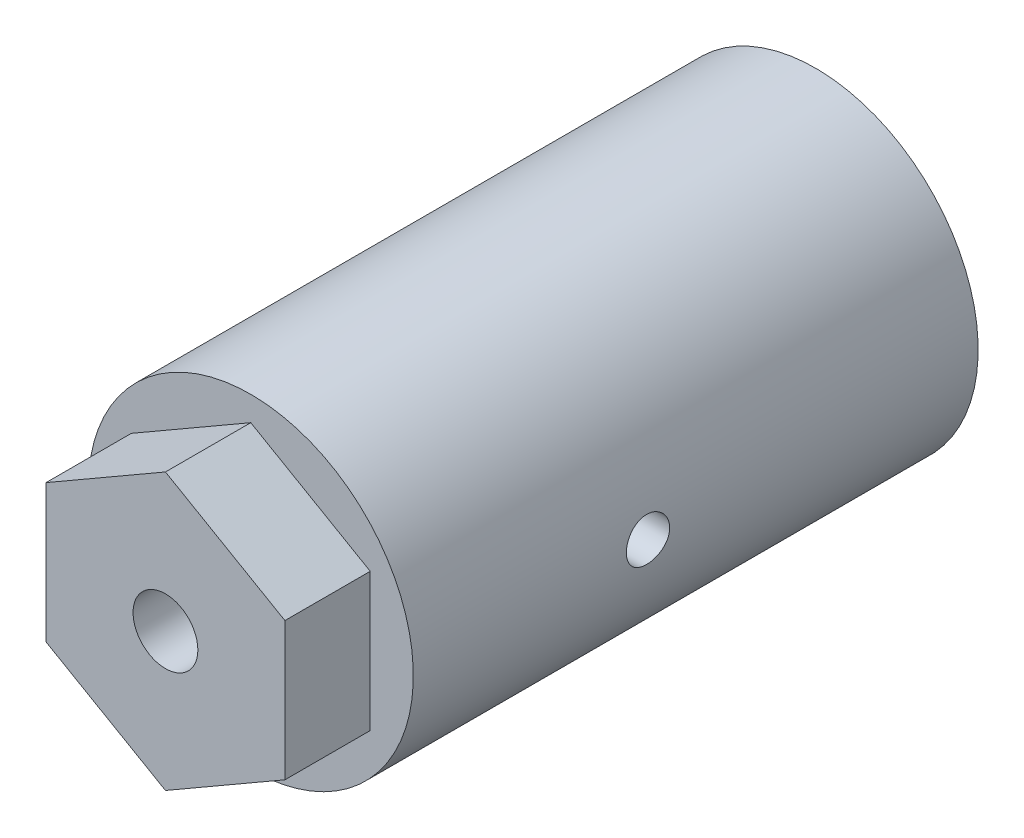
ISO-10303-21;
HEADER;
FILE_DESCRIPTION(('STEP AP214'),'2;1');
FILE_NAME('part.step','',(''),(''),'','','');
FILE_SCHEMA(('AUTOMOTIVE_DESIGN { 1 0 10303 214 1 1 1 1 }'));
ENDSEC;
DATA;
#1=APPLICATION_CONTEXT('core data for automotive mechanical design processes');
#2=APPLICATION_PROTOCOL_DEFINITION('international standard','automotive_design',2000,#1);
#3=PRODUCT_CONTEXT('',#1,'mechanical');
#4=PRODUCT('Part','Part','',(#3));
#5=PRODUCT_RELATED_PRODUCT_CATEGORY('part','',(#4));
#6=PRODUCT_DEFINITION_FORMATION('','',#4);
#7=PRODUCT_DEFINITION_CONTEXT('part definition',#1,'design');
#8=PRODUCT_DEFINITION('design','',#6,#7);
#9=PRODUCT_DEFINITION_SHAPE('','',#8);
#10=(LENGTH_UNIT() NAMED_UNIT(*) SI_UNIT(.MILLI.,.METRE.));
#11=(NAMED_UNIT(*) PLANE_ANGLE_UNIT() SI_UNIT($,.RADIAN.));
#12=(NAMED_UNIT(*) SI_UNIT($,.STERADIAN.) SOLID_ANGLE_UNIT());
#13=UNCERTAINTY_MEASURE_WITH_UNIT(LENGTH_MEASURE(1.E-05),#10,'distance_accuracy_value','');
#14=(GEOMETRIC_REPRESENTATION_CONTEXT(3) GLOBAL_UNCERTAINTY_ASSIGNED_CONTEXT((#13)) GLOBAL_UNIT_ASSIGNED_CONTEXT((#10,
#11,#12)) REPRESENTATION_CONTEXT('',''));
#15=CARTESIAN_POINT('',(0.,0.,0.));
#16=DIRECTION('',(0.,0.,1.));
#17=DIRECTION('',(1.,0.,0.));
#18=AXIS2_PLACEMENT_3D('',#15,#16,#17);
#19=CARTESIAN_POINT('',(7.,4.04145188432738,5.));
#20=DIRECTION('',(-0.5,-0.866025403784439,0.));
#21=DIRECTION('',(0.866025403784439,-0.5,0.));
#22=AXIS2_PLACEMENT_3D('',#19,#20,#21);
#23=PLANE('',#22);
#24=DIRECTION('',(-0.866025403784439,0.5,0.));
#25=VECTOR('',#24,1.);
#26=CARTESIAN_POINT('',(7.,4.04145188432738,0.));
#27=LINE('',#26,#25);
#28=CARTESIAN_POINT('',(7.,4.04145188432738,0.));
#29=VERTEX_POINT('',#28);
#30=CARTESIAN_POINT('',(0.,8.08290376865476,0.));
#31=VERTEX_POINT('',#30);
#32=EDGE_CURVE('E68',#29,#31,#27,.T.);
#33=ORIENTED_EDGE('',*,*,#32,.T.);
#34=DIRECTION('',(0.,0.,-1.));
#35=VECTOR('',#34,1.);
#36=CARTESIAN_POINT('',(0.,8.08290376865476,5.));
#37=LINE('',#36,#35);
#38=CARTESIAN_POINT('',(0.,8.08290376865476,5.));
#39=VERTEX_POINT('',#38);
#40=EDGE_CURVE('E139',#39,#31,#37,.T.);
#41=ORIENTED_EDGE('',*,*,#40,.F.);
#42=DIRECTION('',(-0.866025403784439,0.5,0.));
#43=VECTOR('',#42,1.);
#44=CARTESIAN_POINT('',(7.,4.04145188432738,5.));
#45=LINE('',#44,#43);
#46=CARTESIAN_POINT('',(7.,4.04145188432738,5.));
#47=VERTEX_POINT('',#46);
#48=EDGE_CURVE('E131',#47,#39,#45,.T.);
#49=ORIENTED_EDGE('',*,*,#48,.F.);
#50=DIRECTION('',(0.,0.,-1.));
#51=VECTOR('',#50,1.);
#52=CARTESIAN_POINT('',(7.,4.04145188432738,5.));
#53=LINE('',#52,#51);
#54=EDGE_CURVE('E116',#47,#29,#53,.T.);
#55=ORIENTED_EDGE('',*,*,#54,.T.);
#56=EDGE_LOOP('',(#33,#41,#49,#55));
#57=FACE_BOUND('',#56,.T.);
#58=ADVANCED_FACE('F33',(#57),#23,.F.);
#59=CARTESIAN_POINT('',(0.,8.08290376865476,5.));
#60=DIRECTION('',(0.5,-0.866025403784439,0.));
#61=DIRECTION('',(0.866025403784439,0.5,0.));
#62=AXIS2_PLACEMENT_3D('',#59,#60,#61);
#63=PLANE('',#62);
#64=DIRECTION('',(-0.866025403784439,-0.5,0.));
#65=VECTOR('',#64,1.);
#66=CARTESIAN_POINT('',(0.,8.08290376865476,0.));
#67=LINE('',#66,#65);
#68=CARTESIAN_POINT('',(-7.,4.04145188432738,0.));
#69=VERTEX_POINT('',#68);
#70=EDGE_CURVE('E77',#31,#69,#67,.T.);
#71=ORIENTED_EDGE('',*,*,#70,.T.);
#72=DIRECTION('',(0.,0.,-1.));
#73=VECTOR('',#72,1.);
#74=CARTESIAN_POINT('',(-7.,4.04145188432738,5.));
#75=LINE('',#74,#73);
#76=CARTESIAN_POINT('',(-7.,4.04145188432738,5.));
#77=VERTEX_POINT('',#76);
#78=EDGE_CURVE('E136',#77,#69,#75,.T.);
#79=ORIENTED_EDGE('',*,*,#78,.F.);
#80=DIRECTION('',(-0.866025403784439,-0.5,0.));
#81=VECTOR('',#80,1.);
#82=CARTESIAN_POINT('',(0.,8.08290376865476,5.));
#83=LINE('',#82,#81);
#84=EDGE_CURVE('E178',#39,#77,#83,.T.);
#85=ORIENTED_EDGE('',*,*,#84,.F.);
#86=ORIENTED_EDGE('',*,*,#40,.T.);
#87=EDGE_LOOP('',(#71,#79,#85,#86));
#88=FACE_BOUND('',#87,.T.);
#89=ADVANCED_FACE('F177',(#88),#63,.F.);
#90=CARTESIAN_POINT('',(-7.,4.04145188432738,5.));
#91=DIRECTION('',(1.,0.,0.));
#92=DIRECTION('',(0.,1.,0.));
#93=AXIS2_PLACEMENT_3D('',#90,#91,#92);
#94=PLANE('',#93);
#95=DIRECTION('',(0.,-1.,0.));
#96=VECTOR('',#95,1.);
#97=CARTESIAN_POINT('',(-7.,4.04145188432738,0.));
#98=LINE('',#97,#96);
#99=CARTESIAN_POINT('',(-7.00000000000001,-4.04145188432738,0.));
#100=VERTEX_POINT('',#99);
#101=EDGE_CURVE('E123',#69,#100,#98,.T.);
#102=ORIENTED_EDGE('',*,*,#101,.T.);
#103=DIRECTION('',(0.,0.,-1.));
#104=VECTOR('',#103,1.);
#105=CARTESIAN_POINT('',(-7.00000000000001,-4.04145188432738,5.));
#106=LINE('',#105,#104);
#107=CARTESIAN_POINT('',(-7.00000000000001,-4.04145188432738,5.));
#108=VERTEX_POINT('',#107);
#109=EDGE_CURVE('E110',#108,#100,#106,.T.);
#110=ORIENTED_EDGE('',*,*,#109,.F.);
#111=DIRECTION('',(0.,-1.,0.));
#112=VECTOR('',#111,1.);
#113=CARTESIAN_POINT('',(-7.,4.04145188432738,5.));
#114=LINE('',#113,#112);
#115=EDGE_CURVE('E96',#77,#108,#114,.T.);
#116=ORIENTED_EDGE('',*,*,#115,.F.);
#117=ORIENTED_EDGE('',*,*,#78,.T.);
#118=EDGE_LOOP('',(#102,#110,#116,#117));
#119=FACE_BOUND('',#118,.T.);
#120=ADVANCED_FACE('F174',(#119),#94,.F.);
#121=CARTESIAN_POINT('',(-7.00000000000001,-4.04145188432738,5.));
#122=DIRECTION('',(0.5,0.866025403784438,0.));
#123=DIRECTION('',(-0.866025403784438,0.5,0.));
#124=AXIS2_PLACEMENT_3D('',#121,#122,#123);
#125=PLANE('',#124);
#126=DIRECTION('',(0.866025403784438,-0.5,0.));
#127=VECTOR('',#126,1.);
#128=CARTESIAN_POINT('',(-7.00000000000001,-4.04145188432738,0.));
#129=LINE('',#128,#127);
#130=CARTESIAN_POINT('',(0.,-8.08290376865477,0.));
#131=VERTEX_POINT('',#130);
#132=EDGE_CURVE('E107',#100,#131,#129,.T.);
#133=ORIENTED_EDGE('',*,*,#132,.T.);
#134=DIRECTION('',(0.,0.,-1.));
#135=VECTOR('',#134,1.);
#136=CARTESIAN_POINT('',(0.,-8.08290376865477,5.));
#137=LINE('',#136,#135);
#138=CARTESIAN_POINT('',(0.,-8.08290376865477,5.));
#139=VERTEX_POINT('',#138);
#140=EDGE_CURVE('E103',#139,#131,#137,.T.);
#141=ORIENTED_EDGE('',*,*,#140,.F.);
#142=DIRECTION('',(0.866025403784438,-0.5,0.));
#143=VECTOR('',#142,1.);
#144=CARTESIAN_POINT('',(-7.00000000000001,-4.04145188432738,5.));
#145=LINE('',#144,#143);
#146=EDGE_CURVE('E89',#108,#139,#145,.T.);
#147=ORIENTED_EDGE('',*,*,#146,.F.);
#148=ORIENTED_EDGE('',*,*,#109,.T.);
#149=EDGE_LOOP('',(#133,#141,#147,#148));
#150=FACE_BOUND('',#149,.T.);
#151=ADVANCED_FACE('F104',(#150),#125,.F.);
#152=CARTESIAN_POINT('',(0.,-8.08290376865477,5.));
#153=DIRECTION('',(-0.5,0.866025403784438,0.));
#154=DIRECTION('',(-0.866025403784439,-0.5,0.));
#155=AXIS2_PLACEMENT_3D('',#152,#153,#154);
#156=PLANE('',#155);
#157=DIRECTION('',(0.866025403784439,0.5,0.));
#158=VECTOR('',#157,1.);
#159=CARTESIAN_POINT('',(0.,-8.08290376865477,0.));
#160=LINE('',#159,#158);
#161=CARTESIAN_POINT('',(7.,-4.04145188432738,0.));
#162=VERTEX_POINT('',#161);
#163=EDGE_CURVE('E127',#131,#162,#160,.T.);
#164=ORIENTED_EDGE('',*,*,#163,.T.);
#165=DIRECTION('',(0.,0.,-1.));
#166=VECTOR('',#165,1.);
#167=CARTESIAN_POINT('',(7.,-4.04145188432738,5.));
#168=LINE('',#167,#166);
#169=CARTESIAN_POINT('',(7.,-4.04145188432738,5.));
#170=VERTEX_POINT('',#169);
#171=EDGE_CURVE('E111',#170,#162,#168,.T.);
#172=ORIENTED_EDGE('',*,*,#171,.F.);
#173=DIRECTION('',(0.866025403784439,0.5,0.));
#174=VECTOR('',#173,1.);
#175=CARTESIAN_POINT('',(0.,-8.08290376865477,5.));
#176=LINE('',#175,#174);
#177=EDGE_CURVE('E93',#139,#170,#176,.T.);
#178=ORIENTED_EDGE('',*,*,#177,.F.);
#179=ORIENTED_EDGE('',*,*,#140,.T.);
#180=EDGE_LOOP('',(#164,#172,#178,#179));
#181=FACE_BOUND('',#180,.T.);
#182=ADVANCED_FACE('F113',(#181),#156,.F.);
#183=CARTESIAN_POINT('',(7.,-4.04145188432738,5.));
#184=DIRECTION('',(-1.,0.,0.));
#185=DIRECTION('',(0.,-1.,0.));
#186=AXIS2_PLACEMENT_3D('',#183,#184,#185);
#187=PLANE('',#186);
#188=DIRECTION('',(0.,1.,0.));
#189=VECTOR('',#188,1.);
#190=CARTESIAN_POINT('',(7.,-4.04145188432738,0.));
#191=LINE('',#190,#189);
#192=EDGE_CURVE('E129',#162,#29,#191,.T.);
#193=ORIENTED_EDGE('',*,*,#192,.T.);
#194=ORIENTED_EDGE('',*,*,#54,.F.);
#195=DIRECTION('',(0.,1.,0.));
#196=VECTOR('',#195,1.);
#197=CARTESIAN_POINT('',(7.,-4.04145188432738,5.));
#198=LINE('',#197,#196);
#199=EDGE_CURVE('E55',#170,#47,#198,.T.);
#200=ORIENTED_EDGE('',*,*,#199,.F.);
#201=ORIENTED_EDGE('',*,*,#171,.T.);
#202=EDGE_LOOP('',(#193,#194,#200,#201));
#203=FACE_BOUND('',#202,.T.);
#204=ADVANCED_FACE('F183',(#203),#187,.F.);
#205=CARTESIAN_POINT('',(0.,8.08290376865476,5.));
#206=DIRECTION('',(0.,0.,1.));
#207=DIRECTION('',(1.,0.,0.));
#208=AXIS2_PLACEMENT_3D('',#205,#206,#207);
#209=PLANE('',#208);
#210=CARTESIAN_POINT('',(0.,0.,5.));
#211=DIRECTION('',(0.,0.,1.));
#212=DIRECTION('',(1.,0.,0.));
#213=AXIS2_PLACEMENT_3D('',#210,#211,#212);
#214=CIRCLE('',#213,1.89865);
#215=CARTESIAN_POINT('',(1.89865,0.,5.));
#216=VERTEX_POINT('',#215);
#217=EDGE_CURVE('E332',#216,#216,#214,.T.);
#218=ORIENTED_EDGE('',*,*,#217,.F.);
#219=EDGE_LOOP('',(#218));
#220=FACE_BOUND('',#219,.T.);
#221=ORIENTED_EDGE('',*,*,#48,.T.);
#222=ORIENTED_EDGE('',*,*,#84,.T.);
#223=ORIENTED_EDGE('',*,*,#115,.T.);
#224=ORIENTED_EDGE('',*,*,#146,.T.);
#225=ORIENTED_EDGE('',*,*,#177,.T.);
#226=ORIENTED_EDGE('',*,*,#199,.T.);
#227=EDGE_LOOP('',(#221,#222,#223,#224,#225,#226));
#228=FACE_BOUND('',#227,.T.);
#229=ADVANCED_FACE('F91',(#220,#228),#209,.T.);
#230=CARTESIAN_POINT('',(0.,0.,0.));
#231=DIRECTION('',(0.,0.,-1.));
#232=DIRECTION('',(-1.,0.,0.));
#233=AXIS2_PLACEMENT_3D('',#230,#231,#232);
#234=PLANE('',#233);
#235=CARTESIAN_POINT('',(0.,0.,0.));
#236=DIRECTION('',(0.,0.,-1.));
#237=DIRECTION('',(-1.,0.,0.));
#238=AXIS2_PLACEMENT_3D('',#235,#236,#237);
#239=CIRCLE('',#238,9.525);
#240=CARTESIAN_POINT('',(-9.525,0.,0.));
#241=VERTEX_POINT('',#240);
#242=EDGE_CURVE('E344',#241,#241,#239,.T.);
#243=ORIENTED_EDGE('',*,*,#242,.F.);
#244=EDGE_LOOP('',(#243));
#245=FACE_BOUND('',#244,.T.);
#246=ORIENTED_EDGE('',*,*,#70,.F.);
#247=ORIENTED_EDGE('',*,*,#32,.F.);
#248=ORIENTED_EDGE('',*,*,#192,.F.);
#249=ORIENTED_EDGE('',*,*,#163,.F.);
#250=ORIENTED_EDGE('',*,*,#132,.F.);
#251=ORIENTED_EDGE('',*,*,#101,.F.);
#252=EDGE_LOOP('',(#246,#247,#248,#249,#250,#251));
#253=FACE_BOUND('',#252,.T.);
#254=ADVANCED_FACE('F172',(#245,#253),#234,.F.);
#255=CARTESIAN_POINT('',(0.,0.,-33.1));
#256=DIRECTION('',(0.,0.,1.));
#257=DIRECTION('',(1.,0.,0.));
#258=AXIS2_PLACEMENT_3D('',#255,#256,#257);
#259=CYLINDRICAL_SURFACE('',#258,9.525);
#260=CARTESIAN_POINT('',(9.525,0.,-15.0251407779597));
#261=CARTESIAN_POINT('',(9.52499895696515,-0.0709986106499958,-15.0251377872958));
#262=CARTESIAN_POINT('',(9.52419780911768,-0.142040596840438,-15.0191669913535));
#263=CARTESIAN_POINT('',(9.52107894565584,-0.28214493046268,-14.9954441463132));
#264=CARTESIAN_POINT('',(9.51875968000494,-0.351205179181479,-14.9776800557));
#265=CARTESIAN_POINT('',(9.51286565704157,-0.485297678518135,-14.9309056873209));
#266=CARTESIAN_POINT('',(9.50929177773968,-0.550332708742144,-14.9019032729503));
#267=CARTESIAN_POINT('',(9.50128520529349,-0.67460107334424,-14.8334933876927));
#268=CARTESIAN_POINT('',(9.49685265064689,-0.733835341024011,-14.794087594419));
#269=CARTESIAN_POINT('',(9.48759211691627,-0.845201397290472,-14.705727356841));
#270=CARTESIAN_POINT('',(9.48276207432941,-0.897291820789874,-14.6567209883793));
#271=CARTESIAN_POINT('',(9.47326742349298,-0.992535071524197,-14.550662307896));
#272=CARTESIAN_POINT('',(9.46860282401087,-1.03568742568236,-14.4936095702624));
#273=CARTESIAN_POINT('',(9.4599470150452,-1.11198597940756,-14.3728058348896));
#274=CARTESIAN_POINT('',(9.45595846781259,-1.14509300751437,-14.3090298895858));
#275=CARTESIAN_POINT('',(9.44913392985812,-1.20011091579629,-14.1767610502643));
#276=CARTESIAN_POINT('',(9.44629788950517,-1.22202227810752,-14.1082683595153));
#277=CARTESIAN_POINT('',(9.44211939721104,-1.2539002530033,-13.9689415882911));
#278=CARTESIAN_POINT('',(9.44076817310036,-1.26393704685102,-13.8981238330313));
#279=CARTESIAN_POINT('',(9.43968553771915,-1.27199822148055,-13.7557972539099));
#280=CARTESIAN_POINT('',(9.43995405261954,-1.27002314977337,-13.6842884616948));
#281=CARTESIAN_POINT('',(9.44207252915848,-1.25417418671414,-13.543100860392));
#282=CARTESIAN_POINT('',(9.44391218035188,-1.24037786932669,-13.4734131664823));
#283=CARTESIAN_POINT('',(9.44894956011963,-1.20139920142826,-13.337350886617));
#284=CARTESIAN_POINT('',(9.45214731965871,-1.17621659131025,-13.2709763762403));
#285=CARTESIAN_POINT('',(9.45955220805502,-1.11509765005926,-13.1431851599206));
#286=CARTESIAN_POINT('',(9.46376246768676,-1.07912787675231,-13.0817846372513));
#287=CARTESIAN_POINT('',(9.47271559999658,-0.997479547736237,-12.965861760942));
#288=CARTESIAN_POINT('',(9.47745850036341,-0.951800487190146,-12.9113397651878));
#289=CARTESIAN_POINT('',(9.48698826013327,-0.851601611667402,-12.8102715649702));
#290=CARTESIAN_POINT('',(9.4917751714866,-0.797014983961793,-12.7637915778437));
#291=CARTESIAN_POINT('',(9.50081871624597,-0.680779798034714,-12.6806432794302));
#292=CARTESIAN_POINT('',(9.50507534812444,-0.619131219470905,-12.6439749964073));
#293=CARTESIAN_POINT('',(9.51258190027173,-0.490469059528849,-12.5814898882235));
#294=CARTESIAN_POINT('',(9.51583140777688,-0.423453292564181,-12.5556775107453));
#295=CARTESIAN_POINT('',(9.52095394449085,-0.285985536953518,-12.5156910604123));
#296=CARTESIAN_POINT('',(9.52282704708105,-0.215533731709333,-12.5015163671037));
#297=CARTESIAN_POINT('',(9.52497613274304,-0.073765983611784,-12.48529417315));
#298=CARTESIAN_POINT('',(9.52526412094144,-0.00246064693737218,-12.4831555128272));
#299=CARTESIAN_POINT('',(9.5242430262696,0.139491476933886,-12.4908250846805));
#300=CARTESIAN_POINT('',(9.5229339822156,0.210138280094497,-12.5006330264915));
#301=CARTESIAN_POINT('',(9.51887336352394,0.348496709388816,-12.5318416328585));
#302=CARTESIAN_POINT('',(9.51612723582355,0.416218380485148,-12.5531985338443));
#303=CARTESIAN_POINT('',(9.50949970876473,0.54711923773391,-12.6068531113297));
#304=CARTESIAN_POINT('',(9.50561826609044,0.61029825045493,-12.6391512052781));
#305=CARTESIAN_POINT('',(9.49712246729997,0.73072553792121,-12.7139897967551));
#306=CARTESIAN_POINT('',(9.49250397054029,0.787937092141844,-12.7565889051877));
#307=CARTESIAN_POINT('',(9.48306287730839,0.894431121339855,-12.8507377920171));
#308=CARTESIAN_POINT('',(9.47824027157794,0.943713236156104,-12.9022879767576));
#309=CARTESIAN_POINT('',(9.46889713070679,1.03327548883667,-13.0132786235358));
#310=CARTESIAN_POINT('',(9.46437876472314,1.07349498031676,-13.0727682328384));
#311=CARTESIAN_POINT('',(9.45619224456154,1.14337052935047,-13.1977120034881));
#312=CARTESIAN_POINT('',(9.45252407139858,1.1730268227907,-13.2631660316028));
#313=CARTESIAN_POINT('',(9.4464683548035,1.22083726177974,-13.3979896266473));
#314=CARTESIAN_POINT('',(9.444077087377,1.23902488317715,-13.4673471480686));
#315=CARTESIAN_POINT('',(9.44083550423415,1.26348913636414,-13.6081659843615));
#316=CARTESIAN_POINT('',(9.43998510609402,1.26976640526007,-13.6796271864957));
#317=CARTESIAN_POINT('',(9.43992416872609,1.2702189848693,-13.8220211946517));
#318=CARTESIAN_POINT('',(9.440700716494,1.26448959188503,-13.892953710972));
#319=CARTESIAN_POINT('',(9.44377831760116,1.24129404196048,-14.0328376286507));
#320=CARTESIAN_POINT('',(9.44607937036908,1.22382788941876,-14.1017890307515));
#321=CARTESIAN_POINT('',(9.45194255323205,1.17768567060952,-14.2357365168245));
#322=CARTESIAN_POINT('',(9.45550409288719,1.14901485220091,-14.3007344360189));
#323=CARTESIAN_POINT('',(9.46348784027642,1.08128652652433,-14.4250123641892));
#324=CARTESIAN_POINT('',(9.46791006462843,1.04222881870322,-14.4842922627298));
#325=CARTESIAN_POINT('',(9.47715889161244,0.954484048035378,-14.5959377056642));
#326=CARTESIAN_POINT('',(9.48198831153842,0.905726072890821,-14.6482472897842));
#327=CARTESIAN_POINT('',(9.49148291566056,0.800113775371381,-14.7439775203493));
#328=CARTESIAN_POINT('',(9.49614806106301,0.743257556363409,-14.7873960786661));
#329=CARTESIAN_POINT('',(9.50481103312331,0.622778147286544,-14.8642744108859));
#330=CARTESIAN_POINT('',(9.50880588981075,0.55912678417242,-14.8976903512223));
#331=CARTESIAN_POINT('',(9.51564848618447,0.427096180087956,-14.9533099580358));
#332=CARTESIAN_POINT('',(9.51849745346938,0.358722091145881,-14.9755256299365));
#333=CARTESIAN_POINT('',(9.52205183306974,0.241673639142497,-15.0028827620143));
#334=CARTESIAN_POINT('',(9.52315191908272,0.193732837041921,-15.0112172875972));
#335=CARTESIAN_POINT('',(9.52462635641639,0.0972014639762314,-15.0223472949548));
#336=CARTESIAN_POINT('',(9.52500071413878,0.0486108987465378,-15.0251428255893));
#337=CARTESIAN_POINT('',(9.525,0.,-15.0251407779597));
#338=B_SPLINE_CURVE_WITH_KNOTS('',3,(#260,#261,#262,#263,#264,#265,#266,#267,#268,#269,#270,
#271,#272,#273,#274,#275,#276,#277,#278,#279,#280,#281,#282,#283,#284,#285,#286,#287,#288,#289,
#290,#291,#292,#293,#294,#295,#296,#297,#298,#299,#300,#301,#302,#303,#304,#305,#306,#307,#308,
#309,#310,#311,#312,#313,#314,#315,#316,#317,#318,#319,#320,#321,#322,#323,#324,#325,#326,#327,
#328,#329,#330,#331,#332,#333,#334,#335,#336,#337),.UNSPECIFIED.,.T.,.F.,(4,2,2,2,2,2,2,2,2,2,2,
2,2,2,2,2,2,2,2,2,2,2,2,2,2,2,2,2,2,2,2,2,2,2,2,2,2,2,4),(0.,0.212818250579147,
0.425854133612003,0.638741224945403,0.85159400778162,1.0656314631166,1.27968024419571,
1.49455328159896,1.7094170648154,1.92300451005618,2.13658221987324,2.34876902037258,
2.56096065896665,2.77381705292565,2.98668451711811,3.2012289574788,3.41577401586208,
3.63040688828612,3.84502831698757,4.05802201469959,4.27101053565094,4.48319755756754,
4.69539267614752,4.90882479478877,5.12226660494314,5.33709692380011,5.55192244498386,
5.76611797457014,5.98030204612608,6.19279258960357,6.40528305344654,6.61767411351165,
6.83006927478399,7.04407829075293,7.25813751094487,7.47312149438318,7.68787454670186,
7.83358694295041,7.97929805385254),.UNSPECIFIED.);
#339=CARTESIAN_POINT('',(9.525,0.,-15.0251407779597));
#340=VERTEX_POINT('',#339);
#341=EDGE_CURVE('E327',#340,#340,#338,.T.);
#342=ORIENTED_EDGE('',*,*,#341,.T.);
#343=EDGE_LOOP('',(#342));
#344=FACE_BOUND('',#343,.T.);
#345=CARTESIAN_POINT('',(0.,0.,-33.1));
#346=DIRECTION('',(0.,0.,-1.));
#347=DIRECTION('',(-1.,0.,0.));
#348=AXIS2_PLACEMENT_3D('',#345,#346,#347);
#349=CIRCLE('',#348,9.525);
#350=CARTESIAN_POINT('',(-9.525,0.,-33.1));
#351=VERTEX_POINT('',#350);
#352=EDGE_CURVE('E121',#351,#351,#349,.T.);
#353=ORIENTED_EDGE('',*,*,#352,.F.);
#354=EDGE_LOOP('',(#353));
#355=FACE_BOUND('',#354,.T.);
#356=ORIENTED_EDGE('',*,*,#242,.T.);
#357=EDGE_LOOP('',(#356));
#358=FACE_BOUND('',#357,.T.);
#359=ADVANCED_FACE('F225',(#344,#355,#358),#259,.T.);
#360=CARTESIAN_POINT('',(0.,0.,-33.1));
#361=DIRECTION('',(0.,0.,-1.));
#362=DIRECTION('',(-1.,0.,0.));
#363=AXIS2_PLACEMENT_3D('',#360,#361,#362);
#364=PLANE('',#363);
#365=CARTESIAN_POINT('',(0.,0.,-33.1));
#366=DIRECTION('',(0.,0.,-1.));
#367=DIRECTION('',(-1.,0.,0.));
#368=AXIS2_PLACEMENT_3D('',#365,#366,#367);
#369=CIRCLE('',#368,3.96875);
#370=CARTESIAN_POINT('',(-3.96875,0.,-33.1));
#371=VERTEX_POINT('',#370);
#372=EDGE_CURVE('E341',#371,#371,#369,.T.);
#373=ORIENTED_EDGE('',*,*,#372,.F.);
#374=EDGE_LOOP('',(#373));
#375=FACE_BOUND('',#374,.T.);
#376=ORIENTED_EDGE('',*,*,#352,.T.);
#377=EDGE_LOOP('',(#376));
#378=FACE_BOUND('',#377,.T.);
#379=ADVANCED_FACE('F233',(#375,#378),#364,.T.);
#380=CARTESIAN_POINT('',(0.,0.,-14.05));
#381=DIRECTION('',(0.,0.,-1.));
#382=DIRECTION('',(-1.,0.,0.));
#383=AXIS2_PLACEMENT_3D('',#380,#381,#382);
#384=CYLINDRICAL_SURFACE('',#383,3.96875);
#385=CARTESIAN_POINT('',(0.,0.,-14.05));
#386=DIRECTION('',(0.,0.,-1.));
#387=DIRECTION('',(-1.,0.,0.));
#388=AXIS2_PLACEMENT_3D('',#385,#386,#387);
#389=CIRCLE('',#388,3.96875);
#390=CARTESIAN_POINT('',(3.77160688875739,-1.23529674134509,-14.05));
#391=VERTEX_POINT('',#390);
#392=CARTESIAN_POINT('',(3.77160688875739,1.23529674134509,-14.05));
#393=VERTEX_POINT('',#392);
#394=EDGE_CURVE('E342',#391,#393,#389,.T.);
#395=ORIENTED_EDGE('',*,*,#394,.F.);
#396=CARTESIAN_POINT('',(3.77160688875739,-1.23529674134509,-14.05));
#397=CARTESIAN_POINT('',(3.77432103621251,-1.22700204821715,-14.0847513555256));
#398=CARTESIAN_POINT('',(3.77748671480706,-1.21725242614081,-14.1190988555252));
#399=CARTESIAN_POINT('',(3.78460718022747,-1.1949337549977,-14.1867691678166));
#400=CARTESIAN_POINT('',(3.78856170891878,-1.18236562806048,-14.2200923112016));
#401=CARTESIAN_POINT('',(3.80141745666294,-1.14063557512857,-14.3180550083892));
#402=CARTESIAN_POINT('',(3.81132690130086,-1.10740168892002,-14.3808798241543));
#403=CARTESIAN_POINT('',(3.83265648372519,-1.03115489664595,-14.4998672440187));
#404=CARTESIAN_POINT('',(3.84407551031599,-0.988149167007395,-14.556034691446));
#405=CARTESIAN_POINT('',(3.86718338852062,-0.893443897882659,-14.6604729740323));
#406=CARTESIAN_POINT('',(3.87887234557714,-0.841740909683617,-14.7087406616711));
#407=CARTESIAN_POINT('',(3.90154832114586,-0.729552235036319,-14.7971963791561));
#408=CARTESIAN_POINT('',(3.91251117598455,-0.668882653070157,-14.8371578954377));
#409=CARTESIAN_POINT('',(3.93218648927439,-0.541334184124511,-14.9062773068105));
#410=CARTESIAN_POINT('',(3.94089932435646,-0.474456338897723,-14.9354370103731));
#411=CARTESIAN_POINT('',(3.95492895230464,-0.337827063956046,-14.9814600205398));
#412=CARTESIAN_POINT('',(3.96031319936798,-0.268165434525183,-14.9985686177706));
#413=CARTESIAN_POINT('',(3.9673550333701,-0.126780949546216,-15.0208198222826));
#414=CARTESIAN_POINT('',(3.9690138241878,-0.055058767454525,-15.0259662951356));
#415=CARTESIAN_POINT('',(3.96842951215193,0.085193986963335,-15.0241382234644));
#416=CARTESIAN_POINT('',(3.96634703022174,0.153732338762684,-15.0176626503391));
#417=CARTESIAN_POINT('',(3.95881375180446,0.288684692492293,-14.9937920644199));
#418=CARTESIAN_POINT('',(3.95336285207191,0.355098629241421,-14.9763967169235));
#419=CARTESIAN_POINT('',(3.93966332665052,0.483974662643905,-14.9312909394118));
#420=CARTESIAN_POINT('',(3.93141578515004,0.546438279620275,-14.9035845063424));
#421=CARTESIAN_POINT('',(3.91295252377721,0.665911540412287,-14.8386934463525));
#422=CARTESIAN_POINT('',(3.90273636328492,0.722919958952193,-14.8015066969271));
#423=CARTESIAN_POINT('',(3.88089424099485,0.832395509200627,-14.7169087027284));
#424=CARTESIAN_POINT('',(3.86922742292689,0.88457691185124,-14.669137893016));
#425=CARTESIAN_POINT('',(3.84608699685732,0.980317100288384,-14.5656059915495));
#426=CARTESIAN_POINT('',(3.83461337430476,1.02387653813943,-14.5098455045914));
#427=CARTESIAN_POINT('',(3.8127964099577,1.10239522204061,-14.3898863207896));
#428=CARTESIAN_POINT('',(3.80249595318268,1.13706559573308,-14.3254884901736));
#429=CARTESIAN_POINT('',(3.789148401766,1.18049159346175,-14.2249097735738));
#430=CARTESIAN_POINT('',(3.7850454235353,1.19354939242065,-14.190668499342));
#431=CARTESIAN_POINT('',(3.77767095052311,1.21668447500112,-14.1210946245564));
#432=CARTESIAN_POINT('',(3.77439972853124,1.22676078096464,-14.0857616702162));
#433=CARTESIAN_POINT('',(3.77160688875739,1.23529674134509,-14.05));
#434=B_SPLINE_CURVE_WITH_KNOTS('',3,(#396,#397,#398,#399,#400,#401,#402,#403,#404,#405,#406,
#407,#408,#409,#410,#411,#412,#413,#414,#415,#416,#417,#418,#419,#420,#421,#422,#423,#424,#425,
#426,#427,#428,#429,#430,#431,#432,#433),.UNSPECIFIED.,.F.,.F.,(4,2,2,2,2,2,2,2,2,2,2,2,2,2,2,2,
2,2,4),(0.,0.107418034696275,0.214800976599629,0.428980281682122,0.643002799299049,
0.857110383912447,1.07645518324133,1.29576324259992,1.51046730402641,1.72510197397682,
1.93074095470467,2.13638623879116,2.3419518902982,2.5475636054445,2.76168785947724,
2.97579591346473,3.19616756764986,3.30666709738796,3.41720282085107),.UNSPECIFIED.);
#435=EDGE_CURVE('E157',#391,#393,#434,.T.);
#436=ORIENTED_EDGE('',*,*,#435,.T.);
#437=EDGE_LOOP('',(#395,#436));
#438=FACE_BOUND('',#437,.T.);
#439=ORIENTED_EDGE('',*,*,#372,.T.);
#440=EDGE_LOOP('',(#439));
#441=FACE_BOUND('',#440,.T.);
#442=ADVANCED_FACE('F238',(#438,#441),#384,.F.);
#443=CARTESIAN_POINT('',(0.,0.,-14.05));
#444=DIRECTION('',(0.,0.,-1.));
#445=DIRECTION('',(-1.,0.,0.));
#446=AXIS2_PLACEMENT_3D('',#443,#444,#445);
#447=PLANE('',#446);
#448=DIRECTION('',(1.,0.,0.));
#449=VECTOR('',#448,1.);
#450=CARTESIAN_POINT('',(1.525,1.23529674134509,-14.05));
#451=LINE('',#450,#449);
#452=CARTESIAN_POINT('',(1.525,1.23529674134509,-14.05));
#453=VERTEX_POINT('',#452);
#454=EDGE_CURVE('E11',#453,#393,#451,.T.);
#455=ORIENTED_EDGE('',*,*,#454,.F.);
#456=DIRECTION('',(0.,-1.,0.));
#457=VECTOR('',#456,1.);
#458=CARTESIAN_POINT('',(1.525,0.,-14.05));
#459=LINE('',#458,#457);
#460=CARTESIAN_POINT('',(1.525,-1.23529674134509,-14.05));
#461=VERTEX_POINT('',#460);
#462=EDGE_CURVE('E141',#453,#461,#459,.T.);
#463=ORIENTED_EDGE('',*,*,#462,.T.);
#464=DIRECTION('',(1.,0.,0.));
#465=VECTOR('',#464,1.);
#466=CARTESIAN_POINT('',(1.525,-1.23529674134509,-14.05));
#467=LINE('',#466,#465);
#468=EDGE_CURVE('E40',#391,#461,#467,.F.);
#469=ORIENTED_EDGE('',*,*,#468,.F.);
#470=ORIENTED_EDGE('',*,*,#394,.T.);
#471=EDGE_LOOP('',(#455,#463,#469,#470));
#472=FACE_BOUND('',#471,.T.);
#473=CARTESIAN_POINT('',(0.,0.,-14.05));
#474=DIRECTION('',(0.,0.,1.));
#475=DIRECTION('',(1.,0.,0.));
#476=AXIS2_PLACEMENT_3D('',#473,#474,#475);
#477=CIRCLE('',#476,1.27);
#478=CARTESIAN_POINT('',(1.27,0.,-14.05));
#479=VERTEX_POINT('',#478);
#480=EDGE_CURVE('E145',#479,#479,#477,.T.);
#481=ORIENTED_EDGE('',*,*,#480,.T.);
#482=EDGE_LOOP('',(#481));
#483=FACE_BOUND('',#482,.T.);
#484=ADVANCED_FACE('F161',(#472,#483),#447,.T.);
#485=CARTESIAN_POINT('',(0.,0.,-14.05));
#486=DIRECTION('',(0.,0.,1.));
#487=DIRECTION('',(1.,0.,0.));
#488=AXIS2_PLACEMENT_3D('',#485,#486,#487);
#489=CYLINDRICAL_SURFACE('',#488,1.27);
#490=CARTESIAN_POINT('',(0.,0.,-10.3277310281517));
#491=DIRECTION('',(0.,0.,1.));
#492=DIRECTION('',(1.,0.,0.));
#493=AXIS2_PLACEMENT_3D('',#490,#491,#492);
#494=CIRCLE('',#493,1.27);
#495=CARTESIAN_POINT('',(1.27,0.,-10.3277310281517));
#496=VERTEX_POINT('',#495);
#497=EDGE_CURVE('E142',#496,#496,#494,.T.);
#498=CARTESIAN_POINT('',(1.27,0.,-10.3277310281517));
#499=CARTESIAN_POINT('',(1.27,0.,-10.3665046632751));
#500=CARTESIAN_POINT('',(1.27,0.,-10.4052782983985));
#501=CARTESIAN_POINT('',(1.27,0.,-10.4828255686454));
#502=CARTESIAN_POINT('',(1.27,0.,-10.5215992037688));
#503=CARTESIAN_POINT('',(1.27,0.,-10.5991464740156));
#504=CARTESIAN_POINT('',(1.27,0.,-10.637920109139));
#505=CARTESIAN_POINT('',(1.27,0.,-10.7154673793859));
#506=CARTESIAN_POINT('',(1.27,0.,-10.7542410145093));
#507=CARTESIAN_POINT('',(1.27,0.,-10.8317882847561));
#508=CARTESIAN_POINT('',(1.27,0.,-10.8705619198796));
#509=CARTESIAN_POINT('',(1.27,0.,-10.9481091901264));
#510=CARTESIAN_POINT('',(1.27,0.,-10.9868828252498));
#511=CARTESIAN_POINT('',(1.27,0.,-11.0644300954967));
#512=CARTESIAN_POINT('',(1.27,0.,-11.1032037306201));
#513=CARTESIAN_POINT('',(1.27,0.,-11.1807510008669));
#514=CARTESIAN_POINT('',(1.27,0.,-11.2195246359903));
#515=CARTESIAN_POINT('',(1.27,0.,-11.2970719062372));
#516=CARTESIAN_POINT('',(1.27,0.,-11.3358455413606));
#517=CARTESIAN_POINT('',(1.27,0.,-11.4133928116074));
#518=CARTESIAN_POINT('',(1.27,0.,-11.4521664467309));
#519=CARTESIAN_POINT('',(1.27,0.,-11.5297137169777));
#520=CARTESIAN_POINT('',(1.27,0.,-11.5684873521011));
#521=CARTESIAN_POINT('',(1.27,0.,-11.646034622348));
#522=CARTESIAN_POINT('',(1.27,0.,-11.6848082574714));
#523=CARTESIAN_POINT('',(1.27,0.,-11.7623555277182));
#524=CARTESIAN_POINT('',(1.27,0.,-11.8011291628416));
#525=CARTESIAN_POINT('',(1.27,0.,-11.8786764330885));
#526=CARTESIAN_POINT('',(1.27,0.,-11.9174500682119));
#527=CARTESIAN_POINT('',(1.27,0.,-11.9949973384587));
#528=CARTESIAN_POINT('',(1.27,0.,-12.0337709735822));
#529=CARTESIAN_POINT('',(1.27,0.,-12.111318243829));
#530=CARTESIAN_POINT('',(1.27,0.,-12.1500918789524));
#531=CARTESIAN_POINT('',(1.27,0.,-12.2276391491993));
#532=CARTESIAN_POINT('',(1.27,0.,-12.2664127843227));
#533=CARTESIAN_POINT('',(1.27,0.,-12.3439600545695));
#534=CARTESIAN_POINT('',(1.27,0.,-12.3827336896929));
#535=CARTESIAN_POINT('',(1.27,0.,-12.4602809599398));
#536=CARTESIAN_POINT('',(1.27,0.,-12.4990545950632));
#537=CARTESIAN_POINT('',(1.27,0.,-12.57660186531));
#538=CARTESIAN_POINT('',(1.27,0.,-12.6153755004335));
#539=CARTESIAN_POINT('',(1.27,0.,-12.6929227706803));
#540=CARTESIAN_POINT('',(1.27,0.,-12.7316964058037));
#541=CARTESIAN_POINT('',(1.27,0.,-12.8092436760506));
#542=CARTESIAN_POINT('',(1.27,0.,-12.848017311174));
#543=CARTESIAN_POINT('',(1.27,0.,-12.9255645814208));
#544=CARTESIAN_POINT('',(1.27,0.,-12.9643382165442));
#545=CARTESIAN_POINT('',(1.27,0.,-13.0418854867911));
#546=CARTESIAN_POINT('',(1.27,0.,-13.0806591219145));
#547=CARTESIAN_POINT('',(1.27,0.,-13.1582063921613));
#548=CARTESIAN_POINT('',(1.27,0.,-13.1969800272848));
#549=CARTESIAN_POINT('',(1.27,0.,-13.2745272975316));
#550=CARTESIAN_POINT('',(1.27,0.,-13.313300932655));
#551=CARTESIAN_POINT('',(1.27,0.,-13.3908482029019));
#552=CARTESIAN_POINT('',(1.27,0.,-13.4296218380253));
#553=CARTESIAN_POINT('',(1.27,0.,-13.5071691082721));
#554=CARTESIAN_POINT('',(1.27,0.,-13.5459427433955));
#555=CARTESIAN_POINT('',(1.27,0.,-13.6234900136424));
#556=CARTESIAN_POINT('',(1.27,0.,-13.6622636487658));
#557=CARTESIAN_POINT('',(1.27,0.,-13.7398109190126));
#558=CARTESIAN_POINT('',(1.27,0.,-13.7785845541361));
#559=CARTESIAN_POINT('',(1.27,0.,-13.8561318243829));
#560=CARTESIAN_POINT('',(1.27,0.,-13.8949054595063));
#561=CARTESIAN_POINT('',(1.27,0.,-13.9724527297532));
#562=CARTESIAN_POINT('',(1.27,0.,-14.0112263648766));
#563=CARTESIAN_POINT('',(1.27,0.,-14.05));
#564=B_SPLINE_CURVE_WITH_KNOTS('',3,(#498,#499,#500,#501,#502,#503,#504,#505,#506,#507,#508,
#509,#510,#511,#512,#513,#514,#515,#516,#517,#518,#519,#520,#521,#522,#523,#524,#525,#526,#527,
#528,#529,#530,#531,#532,#533,#534,#535,#536,#537,#538,#539,#540,#541,#542,#543,#544,#545,#546,
#547,#548,#549,#550,#551,#552,#553,#554,#555,#556,#557,#558,#559,#560,#561,#562,#563),
.UNSPECIFIED.,.F.,.F.,(4,2,2,2,2,2,2,2,2,2,2,2,2,2,2,2,2,2,2,2,2,2,2,2,2,2,2,2,2,2,2,2,4),(0.,
0.116320905370259,0.23264181074052,0.34896271611078,0.465283621481041,0.5816045268513,
0.697925432221561,0.81424633759182,0.930567242962081,1.04688814833234,1.1632090537026,
1.27952995907286,1.39585086444312,1.51217176981338,1.62849267518364,1.7448135805539,
1.86113448592416,1.97745539129442,2.09377629666468,2.21009720203494,2.3264181074052,
2.44273901277546,2.55905991814572,2.67538082351598,2.79170172888624,2.9080226342565,
3.02434353962676,3.14066444499702,3.25698535036728,3.37330625573754,3.4896271611078,
3.60594806647806,3.72226897184832),.UNSPECIFIED.);
#565=EDGE_CURVE('BSEAM251',#496,#479,#564,.T.);
#566=ORIENTED_EDGE('',*,*,#497,.T.);
#567=ORIENTED_EDGE('',*,*,#480,.F.);
#568=ORIENTED_EDGE('',*,*,#565,.T.);
#569=ORIENTED_EDGE('',*,*,#565,.F.);
#570=EDGE_LOOP('',(#566,#568,#567,#569));
#571=FACE_BOUND('',#570,.T.);
#572=ADVANCED_FACE('F251',(#571),#489,.F.);
#573=CARTESIAN_POINT('',(0.,0.,-9.95));
#574=DIRECTION('',(0.,0.,1.));
#575=DIRECTION('',(1.,0.,0.));
#576=AXIS2_PLACEMENT_3D('',#573,#574,#575);
#577=CONICAL_SURFACE('',#576,1.89865,1.02974425867665);
#578=CARTESIAN_POINT('',(0.,0.,-9.95));
#579=DIRECTION('',(0.,0.,1.));
#580=DIRECTION('',(1.,0.,0.));
#581=AXIS2_PLACEMENT_3D('',#578,#579,#580);
#582=CIRCLE('',#581,1.89865);
#583=CARTESIAN_POINT('',(1.89865,0.,-9.95));
#584=VERTEX_POINT('',#583);
#585=EDGE_CURVE('E146',#584,#584,#582,.T.);
#586=ORIENTED_EDGE('',*,*,#585,.T.);
#587=EDGE_LOOP('',(#586));
#588=FACE_BOUND('',#587,.T.);
#589=ORIENTED_EDGE('',*,*,#497,.F.);
#590=EDGE_LOOP('',(#589));
#591=FACE_BOUND('',#590,.T.);
#592=ADVANCED_FACE('F256',(#588,#591),#577,.F.);
#593=CARTESIAN_POINT('',(0.,0.,5.));
#594=DIRECTION('',(0.,0.,1.));
#595=DIRECTION('',(1.,0.,0.));
#596=AXIS2_PLACEMENT_3D('',#593,#594,#595);
#597=CYLINDRICAL_SURFACE('',#596,1.89865);
#598=ORIENTED_EDGE('',*,*,#585,.F.);
#599=EDGE_LOOP('',(#598));
#600=FACE_BOUND('',#599,.T.);
#601=ORIENTED_EDGE('',*,*,#217,.T.);
#602=EDGE_LOOP('',(#601));
#603=FACE_BOUND('',#602,.T.);
#604=ADVANCED_FACE('F268',(#600,#603),#597,.F.);
#605=CARTESIAN_POINT('',(1.525,0.,-13.7551407779597));
#606=DIRECTION('',(1.,0.,0.));
#607=DIRECTION('',(0.,0.,-1.));
#608=AXIS2_PLACEMENT_3D('',#605,#606,#607);
#609=CYLINDRICAL_SURFACE('',#608,1.27);
#610=ORIENTED_EDGE('',*,*,#454,.T.);
#611=ORIENTED_EDGE('',*,*,#435,.F.);
#612=ORIENTED_EDGE('',*,*,#468,.T.);
#613=CARTESIAN_POINT('',(1.525,0.,-13.7551407779597));
#614=DIRECTION('',(1.,0.,0.));
#615=DIRECTION('',(0.,0.,-1.));
#616=AXIS2_PLACEMENT_3D('',#613,#614,#615);
#617=CIRCLE('',#616,1.27);
#618=EDGE_CURVE('E46',#453,#461,#617,.T.);
#619=ORIENTED_EDGE('',*,*,#618,.F.);
#620=EDGE_LOOP('',(#610,#611,#612,#619));
#621=FACE_BOUND('',#620,.T.);
#622=ORIENTED_EDGE('',*,*,#341,.F.);
#623=EDGE_LOOP('',(#622));
#624=FACE_BOUND('',#623,.T.);
#625=ADVANCED_FACE('F151',(#621,#624),#609,.F.);
#626=CARTESIAN_POINT('',(1.525,0.,-13.7551407779597));
#627=DIRECTION('',(1.,0.,0.));
#628=DIRECTION('',(0.,0.,-1.));
#629=AXIS2_PLACEMENT_3D('',#626,#627,#628);
#630=PLANE('',#629);
#631=ORIENTED_EDGE('',*,*,#618,.T.);
#632=ORIENTED_EDGE('',*,*,#462,.F.);
#633=EDGE_LOOP('',(#631,#632));
#634=FACE_BOUND('',#633,.T.);
#635=ADVANCED_FACE('F163',(#634),#630,.T.);
#636=CLOSED_SHELL('',(#58,#89,#120,#151,#182,#204,#229,#254,#359,#379,#442,#484,#572,#592,#604,
#625,#635));
#637=MANIFOLD_SOLID_BREP('B2',#636);
#638=ADVANCED_BREP_SHAPE_REPRESENTATION('',(#18,#637),#14);
#639=SHAPE_DEFINITION_REPRESENTATION(#9,#638);
ENDSEC;
END-ISO-10303-21;
